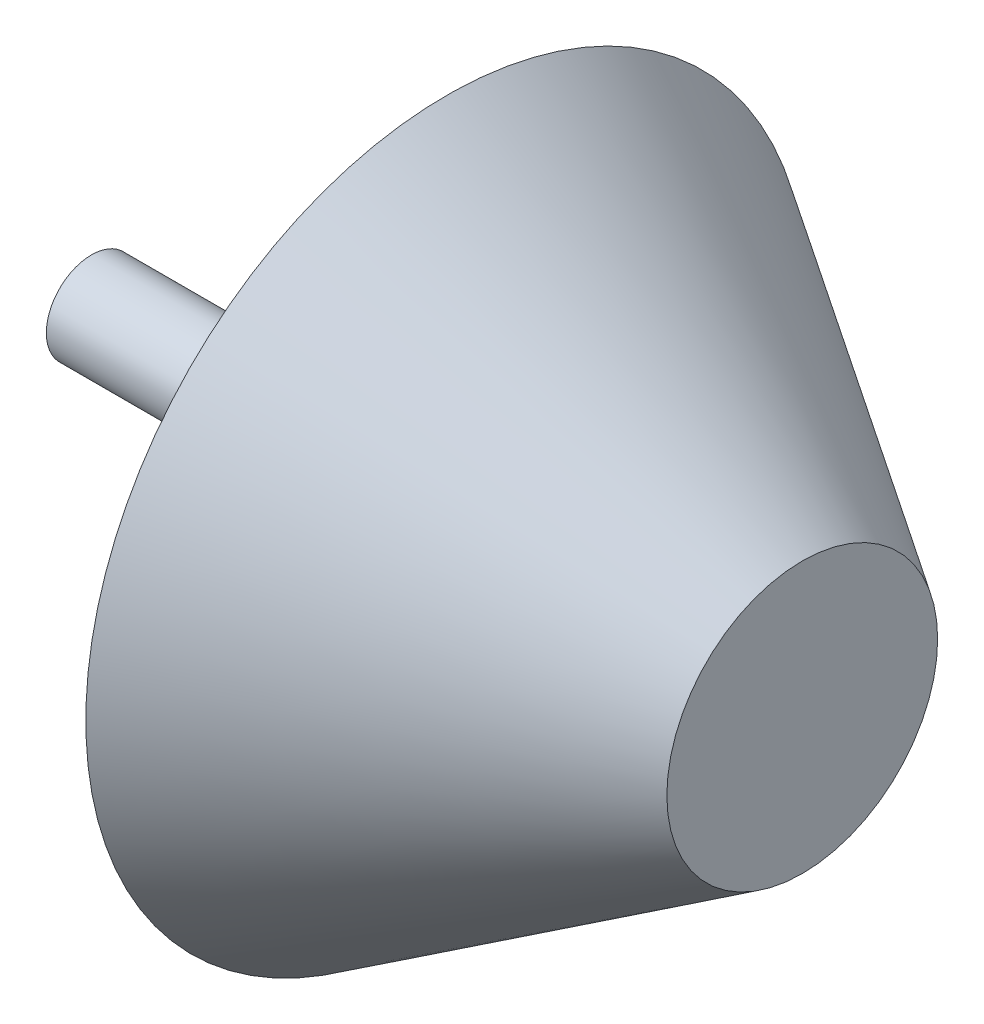
ISO-10303-21;
HEADER;
FILE_DESCRIPTION(('STEP AP214'),'2;1');
FILE_NAME('part.step','',(''),(''),'','','');
FILE_SCHEMA(('AUTOMOTIVE_DESIGN { 1 0 10303 214 1 1 1 1 }'));
ENDSEC;
DATA;
#1=APPLICATION_CONTEXT('core data for automotive mechanical design processes');
#2=APPLICATION_PROTOCOL_DEFINITION('international standard','automotive_design',2000,#1);
#3=PRODUCT_CONTEXT('',#1,'mechanical');
#4=PRODUCT('Part','Part','',(#3));
#5=PRODUCT_RELATED_PRODUCT_CATEGORY('part','',(#4));
#6=PRODUCT_DEFINITION_FORMATION('','',#4);
#7=PRODUCT_DEFINITION_CONTEXT('part definition',#1,'design');
#8=PRODUCT_DEFINITION('design','',#6,#7);
#9=PRODUCT_DEFINITION_SHAPE('','',#8);
#10=(LENGTH_UNIT() NAMED_UNIT(*) SI_UNIT(.MILLI.,.METRE.));
#11=(NAMED_UNIT(*) PLANE_ANGLE_UNIT() SI_UNIT($,.RADIAN.));
#12=(NAMED_UNIT(*) SI_UNIT($,.STERADIAN.) SOLID_ANGLE_UNIT());
#13=UNCERTAINTY_MEASURE_WITH_UNIT(LENGTH_MEASURE(1.E-05),#10,'distance_accuracy_value','');
#14=(GEOMETRIC_REPRESENTATION_CONTEXT(3) GLOBAL_UNCERTAINTY_ASSIGNED_CONTEXT((#13)) GLOBAL_UNIT_ASSIGNED_CONTEXT((#10,
#11,#12)) REPRESENTATION_CONTEXT('',''));
#15=CARTESIAN_POINT('',(0.,0.,0.));
#16=DIRECTION('',(0.,0.,1.));
#17=DIRECTION('',(1.,0.,0.));
#18=AXIS2_PLACEMENT_3D('',#15,#16,#17);
#19=CARTESIAN_POINT('',(100.,0.,0.));
#20=DIRECTION('',(1.,0.,0.));
#21=DIRECTION('',(0.,0.,-1.));
#22=AXIS2_PLACEMENT_3D('',#19,#20,#21);
#23=PLANE('',#22);
#24=CARTESIAN_POINT('',(100.,0.,0.));
#25=DIRECTION('',(1.,0.,0.));
#26=DIRECTION('',(0.,0.,-1.));
#27=AXIS2_PLACEMENT_3D('',#24,#25,#26);
#28=CIRCLE('',#27,38.1);
#29=CARTESIAN_POINT('',(100.,0.,-38.1));
#30=VERTEX_POINT('',#29);
#31=EDGE_CURVE('E55',#30,#30,#28,.T.);
#32=ORIENTED_EDGE('',*,*,#31,.T.);
#33=EDGE_LOOP('',(#32));
#34=FACE_BOUND('',#33,.T.);
#35=ADVANCED_FACE('F47',(#34),#23,.T.);
#36=CARTESIAN_POINT('',(0.,0.,0.));
#37=DIRECTION('',(1.,0.,0.));
#38=DIRECTION('',(0.,0.,-1.));
#39=AXIS2_PLACEMENT_3D('',#36,#37,#38);
#40=PLANE('',#39);
#41=CARTESIAN_POINT('',(0.,0.,0.));
#42=DIRECTION('',(1.,0.,0.));
#43=DIRECTION('',(0.,0.,-1.));
#44=AXIS2_PLACEMENT_3D('',#41,#42,#43);
#45=CIRCLE('',#44,12.7);
#46=CARTESIAN_POINT('',(0.,0.,-12.7));
#47=VERTEX_POINT('',#46);
#48=EDGE_CURVE('E11',#47,#47,#45,.F.);
#49=ORIENTED_EDGE('',*,*,#48,.F.);
#50=EDGE_LOOP('',(#49));
#51=FACE_BOUND('',#50,.T.);
#52=CARTESIAN_POINT('',(0.,0.,0.));
#53=DIRECTION('',(1.,0.,0.));
#54=DIRECTION('',(0.,0.,-1.));
#55=AXIS2_PLACEMENT_3D('',#52,#53,#54);
#56=CIRCLE('',#55,101.6);
#57=CARTESIAN_POINT('',(0.,0.,-101.6));
#58=VERTEX_POINT('',#57);
#59=EDGE_CURVE('E61',#58,#58,#56,.T.);
#60=ORIENTED_EDGE('',*,*,#59,.F.);
#61=EDGE_LOOP('',(#60));
#62=FACE_BOUND('',#61,.T.);
#63=ADVANCED_FACE('F88',(#51,#62),#40,.F.);
#64=CARTESIAN_POINT('',(100.,0.,0.));
#65=DIRECTION('',(-1.,0.,0.));
#66=DIRECTION('',(0.,0.,1.));
#67=AXIS2_PLACEMENT_3D('',#64,#65,#66);
#68=CONICAL_SURFACE('',#67,38.1,0.56575802974209);
#69=ORIENTED_EDGE('',*,*,#59,.T.);
#70=EDGE_LOOP('',(#69));
#71=FACE_BOUND('',#70,.T.);
#72=ORIENTED_EDGE('',*,*,#31,.F.);
#73=EDGE_LOOP('',(#72));
#74=FACE_BOUND('',#73,.T.);
#75=ADVANCED_FACE('F97',(#71,#74),#68,.T.);
#76=CARTESIAN_POINT('',(-100.,0.,0.));
#77=DIRECTION('',(1.,0.,0.));
#78=DIRECTION('',(0.,0.,-1.));
#79=AXIS2_PLACEMENT_3D('',#76,#77,#78);
#80=CYLINDRICAL_SURFACE('',#79,12.7);
#81=CARTESIAN_POINT('',(-100.,0.,0.));
#82=DIRECTION('',(-1.,0.,0.));
#83=DIRECTION('',(0.,0.,1.));
#84=AXIS2_PLACEMENT_3D('',#81,#82,#83);
#85=CIRCLE('',#84,12.7);
#86=CARTESIAN_POINT('',(-100.,0.,12.7));
#87=VERTEX_POINT('',#86);
#88=EDGE_CURVE('E68',#87,#87,#85,.T.);
#89=ORIENTED_EDGE('',*,*,#88,.F.);
#90=EDGE_LOOP('',(#89));
#91=FACE_BOUND('',#90,.T.);
#92=ORIENTED_EDGE('',*,*,#48,.T.);
#93=EDGE_LOOP('',(#92));
#94=FACE_BOUND('',#93,.T.);
#95=ADVANCED_FACE('F99',(#91,#94),#80,.T.);
#96=CARTESIAN_POINT('',(-100.,0.,0.));
#97=DIRECTION('',(-1.,0.,0.));
#98=DIRECTION('',(0.,0.,1.));
#99=AXIS2_PLACEMENT_3D('',#96,#97,#98);
#100=PLANE('',#99);
#101=ORIENTED_EDGE('',*,*,#88,.T.);
#102=EDGE_LOOP('',(#101));
#103=FACE_BOUND('',#102,.T.);
#104=ADVANCED_FACE('F127',(#103),#100,.T.);
#105=CLOSED_SHELL('',(#35,#63,#75,#95,#104));
#106=MANIFOLD_SOLID_BREP('B2',#105);
#107=ADVANCED_BREP_SHAPE_REPRESENTATION('',(#18,#106),#14);
#108=SHAPE_DEFINITION_REPRESENTATION(#9,#107);
ENDSEC;
END-ISO-10303-21;
